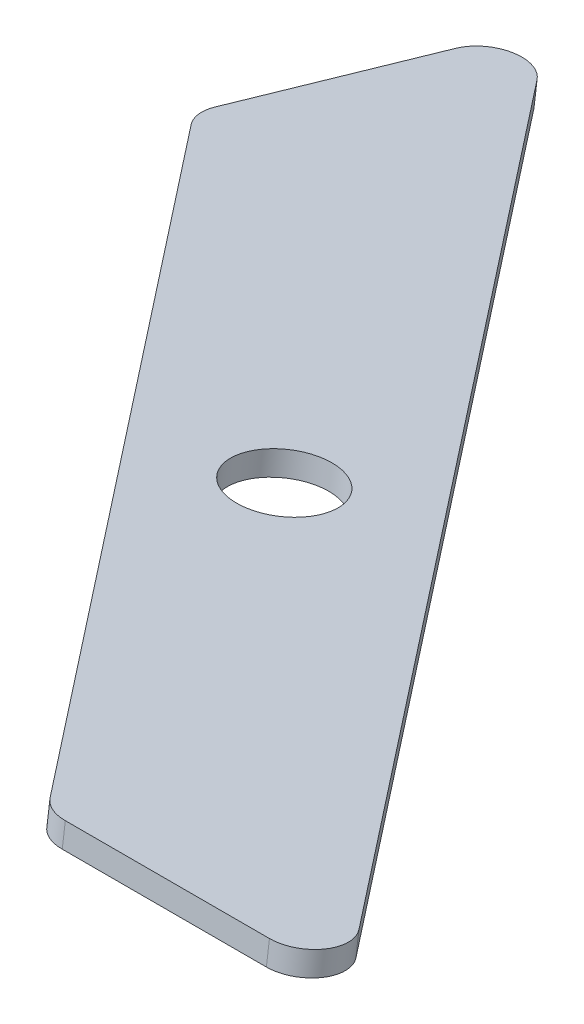
ISO-10303-21;
HEADER;
FILE_DESCRIPTION(('STEP AP214'),'2;1');
FILE_NAME('part.step','',(''),(''),'','','');
FILE_SCHEMA(('AUTOMOTIVE_DESIGN { 1 0 10303 214 1 1 1 1 }'));
ENDSEC;
DATA;
#1=APPLICATION_CONTEXT('core data for automotive mechanical design processes');
#2=APPLICATION_PROTOCOL_DEFINITION('international standard','automotive_design',2000,#1);
#3=PRODUCT_CONTEXT('',#1,'mechanical');
#4=PRODUCT('Part','Part','',(#3));
#5=PRODUCT_RELATED_PRODUCT_CATEGORY('part','',(#4));
#6=PRODUCT_DEFINITION_FORMATION('','',#4);
#7=PRODUCT_DEFINITION_CONTEXT('part definition',#1,'design');
#8=PRODUCT_DEFINITION('design','',#6,#7);
#9=PRODUCT_DEFINITION_SHAPE('','',#8);
#10=(LENGTH_UNIT() NAMED_UNIT(*) SI_UNIT(.MILLI.,.METRE.));
#11=(NAMED_UNIT(*) PLANE_ANGLE_UNIT() SI_UNIT($,.RADIAN.));
#12=(NAMED_UNIT(*) SI_UNIT($,.STERADIAN.) SOLID_ANGLE_UNIT());
#13=UNCERTAINTY_MEASURE_WITH_UNIT(LENGTH_MEASURE(1.E-05),#10,'distance_accuracy_value','');
#14=(GEOMETRIC_REPRESENTATION_CONTEXT(3) GLOBAL_UNCERTAINTY_ASSIGNED_CONTEXT((#13)) GLOBAL_UNIT_ASSIGNED_CONTEXT((#10,
#11,#12)) REPRESENTATION_CONTEXT('',''));
#15=CARTESIAN_POINT('',(0.,0.,0.));
#16=DIRECTION('',(0.,0.,1.));
#17=DIRECTION('',(1.,0.,0.));
#18=AXIS2_PLACEMENT_3D('',#15,#16,#17);
#19=CARTESIAN_POINT('',(7.94631585186611E-11,-787.435528250421,104.50092543493));
#20=DIRECTION('',(-1.00037957732353E-13,0.991308605885831,-0.131557013863534));
#21=DIRECTION('',(0.,0.131557013863534,0.991308605885831));
#22=AXIS2_PLACEMENT_3D('',#19,#20,#21);
#23=PLANE('',#22);
#24=DIRECTION('',(0.627409535794101,0.102442060023813,0.771921562551991));
#25=VECTOR('',#24,1.);
#26=CARTESIAN_POINT('',(274.866911980921,-705.832044975902,719.399613574632));
#27=LINE('',#26,#25);
#28=CARTESIAN_POINT('',(219.008815386425,-714.952433107885,650.675651402412));
#29=VERTEX_POINT('',#28);
#30=CARTESIAN_POINT('',(271.536350982323,-706.375851708612,715.301920276173));
#31=VERTEX_POINT('',#30);
#32=EDGE_CURVE('E174',#29,#31,#27,.T.);
#33=ORIENTED_EDGE('',*,*,#32,.T.);
#34=CARTESIAN_POINT('',(269.558479755098,-706.166199791116,716.881689715682));
#35=DIRECTION('',(-1.00037957732353E-13,0.991308605885831,-0.131557013863534));
#36=DIRECTION('',(0.,0.131557013863534,0.991308605885831));
#37=AXIS2_PLACEMENT_3D('',#34,#35,#36);
#38=CIRCLE('',#37,2.54);
#39=CARTESIAN_POINT('',(269.558479755098,-705.832044975903,719.399613574632));
#40=VERTEX_POINT('',#39);
#41=EDGE_CURVE('E155',#31,#40,#38,.F.);
#42=ORIENTED_EDGE('',*,*,#41,.T.);
#43=DIRECTION('',(-1.,0.,0.));
#44=VECTOR('',#43,1.);
#45=CARTESIAN_POINT('',(254.480094353479,-705.832044975904,719.399613574632));
#46=LINE('',#45,#44);
#47=CARTESIAN_POINT('',(255.695443768438,-705.832044975904,719.399613574632));
#48=VERTEX_POINT('',#47);
#49=EDGE_CURVE('E125',#40,#48,#46,.T.);
#50=ORIENTED_EDGE('',*,*,#49,.T.);
#51=CARTESIAN_POINT('',(255.695443768438,-706.166199791117,716.881689715682));
#52=DIRECTION('',(-1.00037957732353E-13,0.991308605885831,-0.131557013863534));
#53=DIRECTION('',(0.,0.131557013863534,0.991308605885831));
#54=AXIS2_PLACEMENT_3D('',#51,#52,#53);
#55=CIRCLE('',#54,2.54);
#56=CARTESIAN_POINT('',(253.717572541213,-705.956547873621,718.461459155191));
#57=VERTEX_POINT('',#56);
#58=EDGE_CURVE('E61',#48,#57,#55,.F.);
#59=ORIENTED_EDGE('',*,*,#58,.T.);
#60=DIRECTION('',(-0.627409535794101,-0.102442060023815,-0.771921562551991));
#61=VECTOR('',#60,1.);
#62=CARTESIAN_POINT('',(211.341681674956,-712.875590871891,666.325076097812));
#63=LINE('',#62,#61);
#64=CARTESIAN_POINT('',(212.104203487223,-712.751087974174,667.263230517253));
#65=VERTEX_POINT('',#64);
#66=EDGE_CURVE('E141',#57,#65,#63,.T.);
#67=ORIENTED_EDGE('',*,*,#66,.T.);
#68=CARTESIAN_POINT('',(214.082074714448,-712.96073989167,665.683461077745));
#69=DIRECTION('',(-1.00037957732353E-13,0.991308605885831,-0.131557013863534));
#70=DIRECTION('',(0.,0.131557013863534,0.991308605885831));
#71=AXIS2_PLACEMENT_3D('',#68,#69,#70);
#72=CIRCLE('',#71,2.54);
#73=CARTESIAN_POINT('',(211.60020417738,-713.031819482414,665.147862040203));
#74=VERTEX_POINT('',#73);
#75=EDGE_CURVE('E152',#65,#74,#72,.F.);
#76=ORIENTED_EDGE('',*,*,#75,.T.);
#77=DIRECTION('',(0.212714548789268,-0.128546250650561,-0.968621898460417));
#78=VECTOR('',#77,1.);
#79=CARTESIAN_POINT('',(215.678254387826,-715.496239840595,646.577958103953));
#80=LINE('',#79,#78);
#81=CARTESIAN_POINT('',(214.549073622132,-714.813860781133,651.719821804379));
#82=VERTEX_POINT('',#81);
#83=EDGE_CURVE('E135',#74,#82,#80,.T.);
#84=ORIENTED_EDGE('',*,*,#83,.T.);
#85=CARTESIAN_POINT('',(217.0309441592,-714.742781190389,652.255420841921));
#86=DIRECTION('',(-1.00037957732353E-13,0.991308605885831,-0.131557013863534));
#87=DIRECTION('',(0.,0.131557013863534,0.991308605885831));
#88=AXIS2_PLACEMENT_3D('',#85,#86,#87);
#89=CIRCLE('',#88,2.54);
#90=EDGE_CURVE('E150',#82,#29,#89,.F.);
#91=ORIENTED_EDGE('',*,*,#90,.T.);
#92=EDGE_LOOP('',(#33,#42,#50,#59,#67,#76,#84,#91));
#93=FACE_BOUND('',#92,.T.);
#94=CARTESIAN_POINT('',(239.091735599296,-710.008980166073,687.925565337757));
#95=DIRECTION('',(0.,-0.991308605885831,0.131557013863539));
#96=DIRECTION('',(0.,-0.131557013863539,-0.991308605885831));
#97=AXIS2_PLACEMENT_3D('',#94,#95,#96);
#98=CIRCLE('',#97,3.26389999999998);
#99=CARTESIAN_POINT('',(239.091735599296,-710.438369103622,684.690033179007));
#100=VERTEX_POINT('',#99);
#101=EDGE_CURVE('E179',#100,#100,#98,.T.);
#102=ORIENTED_EDGE('',*,*,#101,.F.);
#103=EDGE_LOOP('',(#102));
#104=FACE_BOUND('',#103,.T.);
#105=ADVANCED_FACE('F39',(#93,#104),#23,.F.);
#106=CARTESIAN_POINT('',(7.93052856092766E-11,-785.861825838577,104.292078675422));
#107=DIRECTION('',(-1.00037957732353E-13,0.991308605885831,-0.131557013863534));
#108=DIRECTION('',(0.,0.131557013863534,0.991308605885831));
#109=AXIS2_PLACEMENT_3D('',#106,#107,#108);
#110=PLANE('',#109);
#111=DIRECTION('',(-1.,0.,0.));
#112=VECTOR('',#111,1.);
#113=CARTESIAN_POINT('',(254.480094353479,-704.258342564061,719.190766815124));
#114=LINE('',#113,#112);
#115=CARTESIAN_POINT('',(269.558479755098,-704.258342564059,719.190766815124));
#116=VERTEX_POINT('',#115);
#117=CARTESIAN_POINT('',(255.695443768438,-704.25834256406,719.190766815124));
#118=VERTEX_POINT('',#117);
#119=EDGE_CURVE('E123',#116,#118,#114,.T.);
#120=ORIENTED_EDGE('',*,*,#119,.F.);
#121=CARTESIAN_POINT('',(269.558479755098,-704.592497379272,716.672842956174));
#122=DIRECTION('',(-1.00037957732353E-13,0.991308605885831,-0.131557013863534));
#123=DIRECTION('',(0.,0.131557013863534,0.991308605885831));
#124=AXIS2_PLACEMENT_3D('',#121,#122,#123);
#125=CIRCLE('',#124,2.54);
#126=CARTESIAN_POINT('',(271.536350982323,-704.802149296769,715.093073516665));
#127=VERTEX_POINT('',#126);
#128=EDGE_CURVE('E106',#116,#127,#125,.T.);
#129=ORIENTED_EDGE('',*,*,#128,.T.);
#130=DIRECTION('',(0.627409535794101,0.102442060023813,0.771921562551991));
#131=VECTOR('',#130,1.);
#132=CARTESIAN_POINT('',(274.866911980921,-704.258342564058,719.190766815123));
#133=LINE('',#132,#131);
#134=CARTESIAN_POINT('',(219.008815386424,-713.378730696041,650.466804642904));
#135=VERTEX_POINT('',#134);
#136=EDGE_CURVE('E133',#135,#127,#133,.T.);
#137=ORIENTED_EDGE('',*,*,#136,.F.);
#138=CARTESIAN_POINT('',(217.030944159199,-713.169078778545,652.046574082412));
#139=DIRECTION('',(-1.00037957732353E-13,0.991308605885831,-0.131557013863534));
#140=DIRECTION('',(0.,0.131557013863534,0.991308605885831));
#141=AXIS2_PLACEMENT_3D('',#138,#139,#140);
#142=CIRCLE('',#141,2.54);
#143=CARTESIAN_POINT('',(214.549073622132,-713.240158369289,651.51097504487));
#144=VERTEX_POINT('',#143);
#145=EDGE_CURVE('E126',#135,#144,#142,.T.);
#146=ORIENTED_EDGE('',*,*,#145,.T.);
#147=DIRECTION('',(0.212714548789268,-0.128546250650561,-0.968621898460417));
#148=VECTOR('',#147,1.);
#149=CARTESIAN_POINT('',(215.678254387826,-713.922537428751,646.369111344445));
#150=LINE('',#149,#148);
#151=CARTESIAN_POINT('',(211.60020417738,-711.45811707057,664.939015280694));
#152=VERTEX_POINT('',#151);
#153=EDGE_CURVE('E137',#152,#144,#150,.T.);
#154=ORIENTED_EDGE('',*,*,#153,.F.);
#155=CARTESIAN_POINT('',(214.082074714448,-711.387037479826,665.474614318236));
#156=DIRECTION('',(-1.00037957732353E-13,0.991308605885831,-0.131557013863534));
#157=DIRECTION('',(0.,0.131557013863534,0.991308605885831));
#158=AXIS2_PLACEMENT_3D('',#155,#156,#157);
#159=CIRCLE('',#158,2.54);
#160=CARTESIAN_POINT('',(212.104203487223,-711.17738556233,667.054383757745));
#161=VERTEX_POINT('',#160);
#162=EDGE_CURVE('E144',#152,#161,#159,.T.);
#163=ORIENTED_EDGE('',*,*,#162,.T.);
#164=DIRECTION('',(-0.627409535794101,-0.102442060023815,-0.771921562551991));
#165=VECTOR('',#164,1.);
#166=CARTESIAN_POINT('',(211.341681674956,-711.301888460047,666.116229338304));
#167=LINE('',#166,#165);
#168=CARTESIAN_POINT('',(253.717572541213,-704.382845461777,718.252612395683));
#169=VERTEX_POINT('',#168);
#170=EDGE_CURVE('E132',#169,#161,#167,.T.);
#171=ORIENTED_EDGE('',*,*,#170,.F.);
#172=CARTESIAN_POINT('',(255.695443768438,-704.592497379274,716.672842956174));
#173=DIRECTION('',(-1.00037957732353E-13,0.991308605885831,-0.131557013863534));
#174=DIRECTION('',(0.,0.131557013863534,0.991308605885831));
#175=AXIS2_PLACEMENT_3D('',#172,#173,#174);
#176=CIRCLE('',#175,2.54);
#177=EDGE_CURVE('E117',#169,#118,#176,.T.);
#178=ORIENTED_EDGE('',*,*,#177,.T.);
#179=EDGE_LOOP('',(#120,#129,#137,#146,#154,#163,#171,#178));
#180=FACE_BOUND('',#179,.T.);
#181=CARTESIAN_POINT('',(239.091735599296,-708.435277754229,687.716718578249));
#182=DIRECTION('',(0.,-0.991308605885831,0.131557013863539));
#183=DIRECTION('',(0.,-0.131557013863539,-0.991308605885831));
#184=AXIS2_PLACEMENT_3D('',#181,#182,#183);
#185=CIRCLE('',#184,3.26389999999998);
#186=CARTESIAN_POINT('',(239.091735599296,-708.864666691779,684.481186419498));
#187=VERTEX_POINT('',#186);
#188=EDGE_CURVE('E181',#187,#187,#185,.T.);
#189=ORIENTED_EDGE('',*,*,#188,.T.);
#190=EDGE_LOOP('',(#189));
#191=FACE_BOUND('',#190,.T.);
#192=ADVANCED_FACE('F129',(#180,#191),#110,.T.);
#193=CARTESIAN_POINT('',(215.678254387826,-715.496239840595,646.577958103953));
#194=DIRECTION('',(0.977114384672224,0.0279840908441424,0.21086576281191));
#195=DIRECTION('',(0.210948376811135,0.,-0.977497203229118));
#196=AXIS2_PLACEMENT_3D('',#193,#194,#195);
#197=PLANE('',#196);
#198=ORIENTED_EDGE('',*,*,#83,.F.);
#199=DIRECTION('',(0.,0.99130860588583,-0.131557013863539));
#200=VECTOR('',#199,1.);
#201=CARTESIAN_POINT('',(211.60020417738,-713.031819482414,665.147862040203));
#202=LINE('',#201,#200);
#203=EDGE_CURVE('E11',#74,#152,#202,.T.);
#204=ORIENTED_EDGE('',*,*,#203,.T.);
#205=ORIENTED_EDGE('',*,*,#153,.T.);
#206=DIRECTION('',(0.,0.99130860588583,-0.131557013863539));
#207=VECTOR('',#206,1.);
#208=CARTESIAN_POINT('',(214.549073622132,-714.813860781133,651.719821804379));
#209=LINE('',#208,#207);
#210=EDGE_CURVE('E47',#144,#82,#209,.F.);
#211=ORIENTED_EDGE('',*,*,#210,.T.);
#212=EDGE_LOOP('',(#198,#204,#205,#211));
#213=FACE_BOUND('',#212,.T.);
#214=ADVANCED_FACE('F165',(#213),#197,.F.);
#215=CARTESIAN_POINT('',(274.866911980921,-705.832044975902,719.399613574632));
#216=DIRECTION('',(-0.778689459537388,0.0825401249985042,0.621956472247537));
#217=DIRECTION('',(0.624086014662168,0.,0.781355646490823));
#218=AXIS2_PLACEMENT_3D('',#215,#216,#217);
#219=PLANE('',#218);
#220=ORIENTED_EDGE('',*,*,#136,.T.);
#221=DIRECTION('',(0.,0.99130860588583,-0.131557013863539));
#222=VECTOR('',#221,1.);
#223=CARTESIAN_POINT('',(271.536350982323,-706.375851708612,715.301920276173));
#224=LINE('',#223,#222);
#225=EDGE_CURVE('E111',#127,#31,#224,.F.);
#226=ORIENTED_EDGE('',*,*,#225,.T.);
#227=ORIENTED_EDGE('',*,*,#32,.F.);
#228=DIRECTION('',(0.,0.99130860588583,-0.131557013863539));
#229=VECTOR('',#228,1.);
#230=CARTESIAN_POINT('',(219.008815386425,-714.952433107885,650.675651402412));
#231=LINE('',#230,#229);
#232=EDGE_CURVE('E116',#29,#135,#231,.T.);
#233=ORIENTED_EDGE('',*,*,#232,.T.);
#234=EDGE_LOOP('',(#220,#226,#227,#233));
#235=FACE_BOUND('',#234,.T.);
#236=ADVANCED_FACE('F178',(#235),#219,.F.);
#237=CARTESIAN_POINT('',(254.480094353479,-705.832044975904,719.399613574632));
#238=DIRECTION('',(0.,-0.131557013863539,-0.99130860588583));
#239=DIRECTION('',(0.,0.991308605885831,-0.131557013863539));
#240=AXIS2_PLACEMENT_3D('',#237,#238,#239);
#241=PLANE('',#240);
#242=ORIENTED_EDGE('',*,*,#49,.F.);
#243=DIRECTION('',(0.,0.991308605885831,-0.131557013863539));
#244=VECTOR('',#243,1.);
#245=CARTESIAN_POINT('',(269.558479755098,-705.832044975903,719.399613574632));
#246=LINE('',#245,#244);
#247=EDGE_CURVE('E110',#40,#116,#246,.T.);
#248=ORIENTED_EDGE('',*,*,#247,.T.);
#249=ORIENTED_EDGE('',*,*,#119,.T.);
#250=DIRECTION('',(0.,0.991308605885831,-0.131557013863539));
#251=VECTOR('',#250,1.);
#252=CARTESIAN_POINT('',(255.695443768438,-705.832044975904,719.399613574632));
#253=LINE('',#252,#251);
#254=EDGE_CURVE('E127',#118,#48,#253,.F.);
#255=ORIENTED_EDGE('',*,*,#254,.T.);
#256=EDGE_LOOP('',(#242,#248,#249,#255));
#257=FACE_BOUND('',#256,.T.);
#258=ADVANCED_FACE('F122',(#257),#241,.F.);
#259=CARTESIAN_POINT('',(211.341681674956,-712.875590871891,666.325076097812));
#260=DIRECTION('',(0.778689459537389,-0.0825401249985042,-0.621956472247536));
#261=DIRECTION('',(-0.624086014662167,0.,-0.781355646490824));
#262=AXIS2_PLACEMENT_3D('',#259,#260,#261);
#263=PLANE('',#262);
#264=ORIENTED_EDGE('',*,*,#66,.F.);
#265=DIRECTION('',(0.,0.99130860588583,-0.131557013863539));
#266=VECTOR('',#265,1.);
#267=CARTESIAN_POINT('',(253.717572541213,-705.956547873621,718.461459155191));
#268=LINE('',#267,#266);
#269=EDGE_CURVE('E158',#57,#169,#268,.T.);
#270=ORIENTED_EDGE('',*,*,#269,.T.);
#271=ORIENTED_EDGE('',*,*,#170,.T.);
#272=DIRECTION('',(0.,0.99130860588583,-0.131557013863539));
#273=VECTOR('',#272,1.);
#274=CARTESIAN_POINT('',(212.104203487223,-712.751087974174,667.263230517253));
#275=LINE('',#274,#273);
#276=EDGE_CURVE('E54',#161,#65,#275,.F.);
#277=ORIENTED_EDGE('',*,*,#276,.T.);
#278=EDGE_LOOP('',(#264,#270,#271,#277));
#279=FACE_BOUND('',#278,.T.);
#280=ADVANCED_FACE('F192',(#279),#263,.F.);
#281=CARTESIAN_POINT('',(239.091735599296,-710.008980166073,687.925565337757));
#282=DIRECTION('',(0.,0.99130860588583,-0.131557013863539));
#283=DIRECTION('',(0.,0.131557013863539,0.991308605885831));
#284=AXIS2_PLACEMENT_3D('',#281,#282,#283);
#285=CYLINDRICAL_SURFACE('',#284,3.26389999999998);
#286=ORIENTED_EDGE('',*,*,#101,.T.);
#287=EDGE_LOOP('',(#286));
#288=FACE_BOUND('',#287,.T.);
#289=ORIENTED_EDGE('',*,*,#188,.F.);
#290=EDGE_LOOP('',(#289));
#291=FACE_BOUND('',#290,.T.);
#292=ADVANCED_FACE('F190',(#288,#291),#285,.F.);
#293=CARTESIAN_POINT('',(269.558479755098,-706.166199791116,716.881689715682));
#294=DIRECTION('',(0.,0.99130860588583,-0.131557013863539));
#295=DIRECTION('',(0.,0.131557013863539,0.991308605885831));
#296=AXIS2_PLACEMENT_3D('',#293,#294,#295);
#297=CYLINDRICAL_SURFACE('',#296,2.54);
#298=ORIENTED_EDGE('',*,*,#41,.F.);
#299=ORIENTED_EDGE('',*,*,#225,.F.);
#300=ORIENTED_EDGE('',*,*,#128,.F.);
#301=ORIENTED_EDGE('',*,*,#247,.F.);
#302=EDGE_LOOP('',(#298,#299,#300,#301));
#303=FACE_BOUND('',#302,.T.);
#304=ADVANCED_FACE('F109',(#303),#297,.T.);
#305=CARTESIAN_POINT('',(255.695443768438,-706.166199791118,716.881689715682));
#306=DIRECTION('',(0.,0.99130860588583,-0.131557013863539));
#307=DIRECTION('',(0.,0.131557013863539,0.99130860588583));
#308=AXIS2_PLACEMENT_3D('',#305,#306,#307);
#309=CYLINDRICAL_SURFACE('',#308,2.54);
#310=ORIENTED_EDGE('',*,*,#58,.F.);
#311=ORIENTED_EDGE('',*,*,#254,.F.);
#312=ORIENTED_EDGE('',*,*,#177,.F.);
#313=ORIENTED_EDGE('',*,*,#269,.F.);
#314=EDGE_LOOP('',(#310,#311,#312,#313));
#315=FACE_BOUND('',#314,.T.);
#316=ADVANCED_FACE('F199',(#315),#309,.T.);
#317=CARTESIAN_POINT('',(214.082074714448,-712.96073989167,665.683461077745));
#318=DIRECTION('',(0.,0.99130860588583,-0.131557013863539));
#319=DIRECTION('',(0.,0.131557013863539,0.99130860588583));
#320=AXIS2_PLACEMENT_3D('',#317,#318,#319);
#321=CYLINDRICAL_SURFACE('',#320,2.54);
#322=ORIENTED_EDGE('',*,*,#75,.F.);
#323=ORIENTED_EDGE('',*,*,#276,.F.);
#324=ORIENTED_EDGE('',*,*,#162,.F.);
#325=ORIENTED_EDGE('',*,*,#203,.F.);
#326=EDGE_LOOP('',(#322,#323,#324,#325));
#327=FACE_BOUND('',#326,.T.);
#328=ADVANCED_FACE('F216',(#327),#321,.T.);
#329=CARTESIAN_POINT('',(217.0309441592,-714.742781190389,652.255420841921));
#330=DIRECTION('',(0.,0.99130860588583,-0.131557013863539));
#331=DIRECTION('',(0.,0.131557013863539,0.99130860588583));
#332=AXIS2_PLACEMENT_3D('',#329,#330,#331);
#333=CYLINDRICAL_SURFACE('',#332,2.54);
#334=ORIENTED_EDGE('',*,*,#90,.F.);
#335=ORIENTED_EDGE('',*,*,#210,.F.);
#336=ORIENTED_EDGE('',*,*,#145,.F.);
#337=ORIENTED_EDGE('',*,*,#232,.F.);
#338=EDGE_LOOP('',(#334,#335,#336,#337));
#339=FACE_BOUND('',#338,.T.);
#340=ADVANCED_FACE('F41',(#339),#333,.T.);
#341=CLOSED_SHELL('',(#105,#192,#214,#236,#258,#280,#292,#304,#316,#328,#340));
#342=MANIFOLD_SOLID_BREP('B2',#341);
#343=ADVANCED_BREP_SHAPE_REPRESENTATION('',(#18,#342),#14);
#344=SHAPE_DEFINITION_REPRESENTATION(#9,#343);
ENDSEC;
END-ISO-10303-21;
